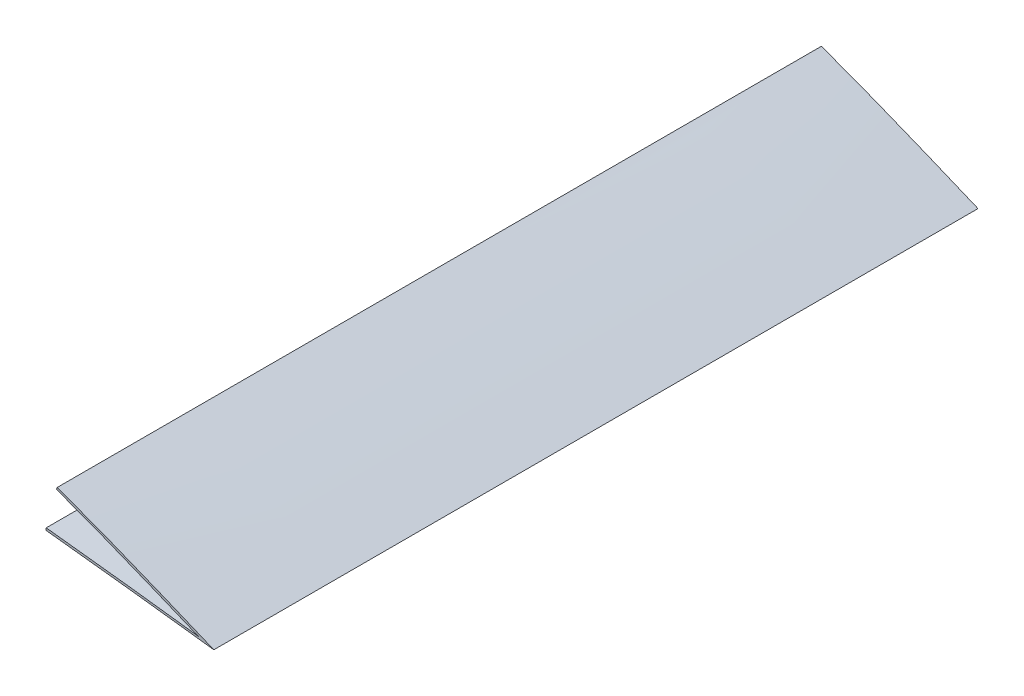
ISO-10303-21;
HEADER;
FILE_DESCRIPTION(('STEP AP214'),'2;1');
FILE_NAME('part.step','',(''),(''),'','','');
FILE_SCHEMA(('AUTOMOTIVE_DESIGN { 1 0 10303 214 1 1 1 1 }'));
ENDSEC;
DATA;
#1=APPLICATION_CONTEXT('core data for automotive mechanical design processes');
#2=APPLICATION_PROTOCOL_DEFINITION('international standard','automotive_design',2000,#1);
#3=PRODUCT_CONTEXT('',#1,'mechanical');
#4=PRODUCT('Part','Part','',(#3));
#5=PRODUCT_RELATED_PRODUCT_CATEGORY('part','',(#4));
#6=PRODUCT_DEFINITION_FORMATION('','',#4);
#7=PRODUCT_DEFINITION_CONTEXT('part definition',#1,'design');
#8=PRODUCT_DEFINITION('design','',#6,#7);
#9=PRODUCT_DEFINITION_SHAPE('','',#8);
#10=(LENGTH_UNIT() NAMED_UNIT(*) SI_UNIT(.MILLI.,.METRE.));
#11=(NAMED_UNIT(*) PLANE_ANGLE_UNIT() SI_UNIT($,.RADIAN.));
#12=(NAMED_UNIT(*) SI_UNIT($,.STERADIAN.) SOLID_ANGLE_UNIT());
#13=UNCERTAINTY_MEASURE_WITH_UNIT(LENGTH_MEASURE(1.E-05),#10,'distance_accuracy_value','');
#14=(GEOMETRIC_REPRESENTATION_CONTEXT(3) GLOBAL_UNCERTAINTY_ASSIGNED_CONTEXT((#13)) GLOBAL_UNIT_ASSIGNED_CONTEXT((#10,
#11,#12)) REPRESENTATION_CONTEXT('',''));
#15=CARTESIAN_POINT('',(0.,0.,0.));
#16=DIRECTION('',(0.,0.,1.));
#17=DIRECTION('',(1.,0.,0.));
#18=AXIS2_PLACEMENT_3D('',#15,#16,#17);
#19=CARTESIAN_POINT('',(1988.02305883041,2944.18599810179,174.625));
#20=CARTESIAN_POINT('',(1988.4860936965,2944.14044059067,174.625));
#21=CARTESIAN_POINT('',(1990.11861976774,2943.97758883364,174.625));
#22=CARTESIAN_POINT('',(1992.87856538639,2943.65192778852,174.625));
#23=CARTESIAN_POINT('',(1996.26056182215,2943.27824299011,174.625));
#24=CARTESIAN_POINT('',(1999.50276368961,2942.88136099166,174.625));
#25=CARTESIAN_POINT('',(2002.59505450618,2942.58817036161,174.625));
#26=CARTESIAN_POINT('',(2005.51427925806,2942.19869931625,174.625));
#27=CARTESIAN_POINT('',(2008.28630101592,2941.92861298624,174.625));
#28=CARTESIAN_POINT('',(2010.88552648472,2941.56905741507,174.625));
#29=CARTESIAN_POINT('',(2013.3339009843,2941.29983663925,174.625));
#30=CARTESIAN_POINT('',(2015.60789868894,2941.03328103495,174.625));
#31=CARTESIAN_POINT('',(2017.70584724161,2940.75505034335,174.625));
#32=CARTESIAN_POINT('',(2019.62940298667,2940.57851809757,174.625));
#33=CARTESIAN_POINT('',(2021.36766207254,2940.31482751687,174.625));
#34=CARTESIAN_POINT('',(2022.93120368427,2940.14747141157,174.625));
#35=CARTESIAN_POINT('',(2024.3197481941,2939.97788358142,174.625));
#36=CARTESIAN_POINT('',(2025.44054917517,2939.81131808059,174.625));
#37=CARTESIAN_POINT('',(2026.11368253309,2939.75555714232,174.625));
#38=CARTESIAN_POINT('',(2026.37812322283,2939.72601974893,174.625));
#39=B_SPLINE_CURVE_WITH_KNOTS('',3,(#19,#20,#21,#22,#23,#24,#25,#26,#27,#28,#29,#30,#31,#32,#33,
#34,#35,#36,#37,#38),.UNSPECIFIED.,.F.,.F.,(4,1,1,1,1,1,1,1,1,1,1,1,1,1,1,1,1,4),
(28.4329806907909,28.4879334748767,28.6267563678009,28.7612032643811,28.8898159231674,
29.0125341125278,29.1280218659914,29.2376094309799,29.3414338076934,29.4378933017833,
29.5285192075717,29.6118543910173,29.6878305241122,29.7565901692537,29.819438039544,
29.8735369008995,29.9218053046442,29.9532403861273),.UNSPECIFIED.);
#40=DIRECTION('',(0.,0.,-1.));
#41=VECTOR('',#40,1.);
#42=SURFACE_OF_LINEAR_EXTRUSION('',#39,#41);
#43=CARTESIAN_POINT('',(1988.02305883041,2944.18599810179,0.));
#44=CARTESIAN_POINT('',(1988.4860936965,2944.14044059067,0.));
#45=CARTESIAN_POINT('',(1990.11861976774,2943.97758883364,0.));
#46=CARTESIAN_POINT('',(1992.87856538639,2943.65192778852,0.));
#47=CARTESIAN_POINT('',(1996.26056182215,2943.27824299011,0.));
#48=CARTESIAN_POINT('',(1999.50276368961,2942.88136099166,0.));
#49=CARTESIAN_POINT('',(2002.59505450618,2942.58817036161,0.));
#50=CARTESIAN_POINT('',(2005.51427925806,2942.19869931625,0.));
#51=CARTESIAN_POINT('',(2008.28630101592,2941.92861298624,0.));
#52=CARTESIAN_POINT('',(2010.88552648472,2941.56905741507,0.));
#53=CARTESIAN_POINT('',(2013.3339009843,2941.29983663925,0.));
#54=CARTESIAN_POINT('',(2015.60789868894,2941.03328103495,0.));
#55=CARTESIAN_POINT('',(2017.70584724161,2940.75505034335,0.));
#56=CARTESIAN_POINT('',(2019.62940298667,2940.57851809757,0.));
#57=CARTESIAN_POINT('',(2021.36766207254,2940.31482751687,0.));
#58=CARTESIAN_POINT('',(2022.93120368427,2940.14747141157,0.));
#59=CARTESIAN_POINT('',(2024.3197481941,2939.97788358142,0.));
#60=CARTESIAN_POINT('',(2025.44054917517,2939.81131808059,0.));
#61=CARTESIAN_POINT('',(2026.11368253309,2939.75555714232,0.));
#62=CARTESIAN_POINT('',(2026.37812322283,2939.72601974893,0.));
#63=B_SPLINE_CURVE_WITH_KNOTS('',3,(#43,#44,#45,#46,#47,#48,#49,#50,#51,#52,#53,#54,#55,#56,#57,
#58,#59,#60,#61,#62),.UNSPECIFIED.,.F.,.F.,(4,1,1,1,1,1,1,1,1,1,1,1,1,1,1,1,1,4),
(28.4329806907909,28.4879334748767,28.6267563678009,28.7612032643811,28.8898159231674,
29.0125341125278,29.1280218659914,29.2376094309799,29.3414338076934,29.4378933017833,
29.5285192075717,29.6118543910173,29.6878305241122,29.7565901692537,29.819438039544,
29.8735369008995,29.9218053046442,29.9532403861273),.UNSPECIFIED.);
#64=CARTESIAN_POINT('',(1988.02305883041,2944.18599810179,0.));
#65=VERTEX_POINT('',#64);
#66=CARTESIAN_POINT('',(2026.37812322283,2939.72601974893,0.));
#67=VERTEX_POINT('',#66);
#68=EDGE_CURVE('E172',#65,#67,#63,.T.);
#69=ORIENTED_EDGE('',*,*,#68,.T.);
#70=DIRECTION('',(0.,0.,-1.));
#71=VECTOR('',#70,1.);
#72=CARTESIAN_POINT('',(2026.37812322283,2939.72601974893,174.625));
#73=LINE('',#72,#71);
#74=CARTESIAN_POINT('',(2026.37812322283,2939.72601974893,174.625));
#75=VERTEX_POINT('',#74);
#76=EDGE_CURVE('E11',#75,#67,#73,.T.);
#77=ORIENTED_EDGE('',*,*,#76,.F.);
#78=CARTESIAN_POINT('',(1988.02305883041,2944.18599810179,174.625));
#79=VERTEX_POINT('',#78);
#80=EDGE_CURVE('E144',#79,#75,#39,.T.);
#81=ORIENTED_EDGE('',*,*,#80,.F.);
#82=DIRECTION('',(0.,0.,-1.));
#83=VECTOR('',#82,1.);
#84=CARTESIAN_POINT('',(1988.02305883041,2944.18599810179,174.625));
#85=LINE('',#84,#83);
#86=EDGE_CURVE('E114',#79,#65,#85,.T.);
#87=ORIENTED_EDGE('',*,*,#86,.T.);
#88=EDGE_LOOP('',(#69,#77,#81,#87));
#89=FACE_BOUND('',#88,.T.);
#90=ADVANCED_FACE('F33',(#89),#42,.F.);
#91=CARTESIAN_POINT('',(2026.37812322283,2939.72601974893,174.625));
#92=CARTESIAN_POINT('',(2025.7723670329,2939.96681770488,174.625));
#93=CARTESIAN_POINT('',(2025.16700119327,2940.20806577561,174.625));
#94=CARTESIAN_POINT('',(2024.56327016065,2940.45119895005,174.625));
#95=CARTESIAN_POINT('',(2024.25244988756,2940.57637177635,174.625));
#96=CARTESIAN_POINT('',(2023.94206292393,2940.70204425383,174.625));
#97=CARTESIAN_POINT('',(2023.63227908525,2940.82841219755,174.625));
#98=CARTESIAN_POINT('',(2019.92290730254,2942.34155015426,174.625));
#99=CARTESIAN_POINT('',(2016.30001050763,2943.95440282884,174.625));
#100=CARTESIAN_POINT('',(2008.84038212805,2946.88486291156,174.625));
#101=CARTESIAN_POINT('',(2005.18204635352,2948.44600331714,174.625));
#102=CARTESIAN_POINT('',(1998.49830218971,2950.9925617946,174.625));
#103=CARTESIAN_POINT('',(1995.57534901207,2952.14370847279,174.625));
#104=CARTESIAN_POINT('',(1991.93586782327,2953.47362866195,174.625));
#105=CARTESIAN_POINT('',(1991.26652278171,2953.72164072025,174.625));
#106=CARTESIAN_POINT('',(1990.59802874074,2953.97095841238,174.625));
#107=B_SPLINE_CURVE_WITH_KNOTS('',3,(#91,#92,#93,#94,#95,#96,#97,#98,#99,#100,#101,#102,#103,
#104,#105,#106),.UNSPECIFIED.,.F.,.F.,(4,3,3,2,2,2,4),(0.099020879068913,0.175577173941332,
0.214990831999981,0.686932530696415,1.15887422939285,1.53165502309098,1.61589570104789),.UNSPECIFIED.);
#108=DIRECTION('',(0.,0.,-1.));
#109=VECTOR('',#108,1.);
#110=SURFACE_OF_LINEAR_EXTRUSION('',#107,#109);
#111=CARTESIAN_POINT('',(2026.37812322283,2939.72601974893,0.));
#112=CARTESIAN_POINT('',(2025.7723670329,2939.96681770488,0.));
#113=CARTESIAN_POINT('',(2025.16700119327,2940.20806577561,0.));
#114=CARTESIAN_POINT('',(2024.56327016065,2940.45119895005,0.));
#115=CARTESIAN_POINT('',(2024.25244988756,2940.57637177635,0.));
#116=CARTESIAN_POINT('',(2023.94206292393,2940.70204425383,0.));
#117=CARTESIAN_POINT('',(2023.63227908525,2940.82841219755,0.));
#118=CARTESIAN_POINT('',(2019.92290730254,2942.34155015426,0.));
#119=CARTESIAN_POINT('',(2016.30001050763,2943.95440282884,0.));
#120=CARTESIAN_POINT('',(2008.84038212805,2946.88486291156,0.));
#121=CARTESIAN_POINT('',(2005.18204635352,2948.44600331714,0.));
#122=CARTESIAN_POINT('',(1998.49830218971,2950.9925617946,0.));
#123=CARTESIAN_POINT('',(1995.57534901207,2952.14370847279,0.));
#124=CARTESIAN_POINT('',(1991.93586782327,2953.47362866195,0.));
#125=CARTESIAN_POINT('',(1991.26652278171,2953.72164072025,0.));
#126=CARTESIAN_POINT('',(1990.59802874074,2953.97095841238,0.));
#127=B_SPLINE_CURVE_WITH_KNOTS('',3,(#111,#112,#113,#114,#115,#116,#117,#118,#119,#120,#121,
#122,#123,#124,#125,#126),.UNSPECIFIED.,.F.,.F.,(4,3,3,2,2,2,4),(0.099020879068913,
0.175577173941332,0.214990831999981,0.686932530696415,1.15887422939285,1.53165502309098,
1.61589570104789),.UNSPECIFIED.);
#128=CARTESIAN_POINT('',(1990.59802874074,2953.97095841238,0.));
#129=VERTEX_POINT('',#128);
#130=EDGE_CURVE('E170',#67,#129,#127,.T.);
#131=ORIENTED_EDGE('',*,*,#130,.T.);
#132=DIRECTION('',(0.,0.,-1.));
#133=VECTOR('',#132,1.);
#134=CARTESIAN_POINT('',(1990.59802874074,2953.97095841238,174.625));
#135=LINE('',#134,#133);
#136=CARTESIAN_POINT('',(1990.59802874074,2953.97095841238,174.625));
#137=VERTEX_POINT('',#136);
#138=EDGE_CURVE('E42',#137,#129,#135,.T.);
#139=ORIENTED_EDGE('',*,*,#138,.F.);
#140=EDGE_CURVE('E87',#75,#137,#107,.T.);
#141=ORIENTED_EDGE('',*,*,#140,.F.);
#142=ORIENTED_EDGE('',*,*,#76,.T.);
#143=EDGE_LOOP('',(#131,#139,#141,#142));
#144=FACE_BOUND('',#143,.T.);
#145=ADVANCED_FACE('F137',(#144),#110,.F.);
#146=CARTESIAN_POINT('',(1990.42148669339,2953.49755342874,174.625));
#147=DIRECTION('',(0.936968441110629,-0.349413995659473,0.));
#148=DIRECTION('',(0.349413995659473,0.936968441110629,0.));
#149=AXIS2_PLACEMENT_3D('',#146,#147,#148);
#150=PLANE('',#149);
#151=DIRECTION('',(-0.349413995659473,-0.936968441110629,0.));
#152=VECTOR('',#151,1.);
#153=CARTESIAN_POINT('',(1990.42148669339,2953.49755342874,0.));
#154=LINE('',#153,#152);
#155=CARTESIAN_POINT('',(1990.42148669339,2953.49755342874,0.));
#156=VERTEX_POINT('',#155);
#157=EDGE_CURVE('E166',#129,#156,#154,.T.);
#158=ORIENTED_EDGE('',*,*,#157,.T.);
#159=DIRECTION('',(0.,0.,-1.));
#160=VECTOR('',#159,1.);
#161=CARTESIAN_POINT('',(1990.42148669339,2953.49755342874,174.625));
#162=LINE('',#161,#160);
#163=CARTESIAN_POINT('',(1990.42148669339,2953.49755342874,174.625));
#164=VERTEX_POINT('',#163);
#165=EDGE_CURVE('E109',#164,#156,#162,.T.);
#166=ORIENTED_EDGE('',*,*,#165,.F.);
#167=DIRECTION('',(-0.349413995659473,-0.936968441110629,0.));
#168=VECTOR('',#167,1.);
#169=CARTESIAN_POINT('',(1990.42148669339,2953.49755342874,174.625));
#170=LINE('',#169,#168);
#171=EDGE_CURVE('E100',#137,#164,#170,.T.);
#172=ORIENTED_EDGE('',*,*,#171,.F.);
#173=ORIENTED_EDGE('',*,*,#138,.T.);
#174=EDGE_LOOP('',(#158,#166,#172,#173));
#175=FACE_BOUND('',#174,.T.);
#176=ADVANCED_FACE('F135',(#175),#150,.F.);
#177=CARTESIAN_POINT('',(1990.42148669339,2953.49755342874,174.625));
#178=CARTESIAN_POINT('',(1991.26608646929,2953.18432727958,174.625));
#179=CARTESIAN_POINT('',(1992.11061416994,2952.87083292376,174.625));
#180=CARTESIAN_POINT('',(1997.44616335028,2950.89237515585,174.625));
#181=CARTESIAN_POINT('',(2001.86633493205,2949.19683033505,174.625));
#182=CARTESIAN_POINT('',(2010.80211572768,2945.57558877682,174.625));
#183=CARTESIAN_POINT('',(2015.21732369742,2943.78783922893,174.625));
#184=CARTESIAN_POINT('',(2020.71630821281,2941.50699908588,174.625));
#185=CARTESIAN_POINT('',(2021.79802890697,2941.06151206462,174.625));
#186=CARTESIAN_POINT('',(2022.86646084304,2940.6145709774,174.625));
#187=B_SPLINE_CURVE_WITH_KNOTS('',3,(#177,#178,#179,#180,#181,#182,#183,#184,#185,#186),
.UNSPECIFIED.,.F.,.F.,(4,2,2,2,4),(0.2403730921367,0.346917733175911,0.913321397798007,
1.4797250624201,1.6161767153474),.UNSPECIFIED.);
#188=DIRECTION('',(0.,0.,-1.));
#189=VECTOR('',#188,1.);
#190=SURFACE_OF_LINEAR_EXTRUSION('',#187,#189);
#191=CARTESIAN_POINT('',(1990.42148669339,2953.49755342874,0.));
#192=CARTESIAN_POINT('',(1991.26608646929,2953.18432727958,0.));
#193=CARTESIAN_POINT('',(1992.11061416994,2952.87083292376,0.));
#194=CARTESIAN_POINT('',(1997.44616335028,2950.89237515585,0.));
#195=CARTESIAN_POINT('',(2001.86633493205,2949.19683033505,0.));
#196=CARTESIAN_POINT('',(2010.80211572768,2945.57558877682,0.));
#197=CARTESIAN_POINT('',(2015.21732369742,2943.78783922893,0.));
#198=CARTESIAN_POINT('',(2020.71630821281,2941.50699908588,0.));
#199=CARTESIAN_POINT('',(2021.79802890697,2941.06151206462,0.));
#200=CARTESIAN_POINT('',(2022.86646084304,2940.6145709774,0.));
#201=B_SPLINE_CURVE_WITH_KNOTS('',3,(#191,#192,#193,#194,#195,#196,#197,#198,#199,#200),
.UNSPECIFIED.,.F.,.F.,(4,2,2,2,4),(0.2403730921367,0.346917733175911,0.913321397798007,
1.4797250624201,1.6161767153474),.UNSPECIFIED.);
#202=CARTESIAN_POINT('',(2022.86646084304,2940.6145709774,0.));
#203=VERTEX_POINT('',#202);
#204=EDGE_CURVE('E108',#156,#203,#201,.T.);
#205=ORIENTED_EDGE('',*,*,#204,.T.);
#206=DIRECTION('',(0.,0.,-1.));
#207=VECTOR('',#206,1.);
#208=CARTESIAN_POINT('',(2022.86646084304,2940.6145709774,174.625));
#209=LINE('',#208,#207);
#210=CARTESIAN_POINT('',(2022.86646084304,2940.6145709774,174.625));
#211=VERTEX_POINT('',#210);
#212=EDGE_CURVE('E105',#211,#203,#209,.T.);
#213=ORIENTED_EDGE('',*,*,#212,.F.);
#214=EDGE_CURVE('E94',#164,#211,#187,.T.);
#215=ORIENTED_EDGE('',*,*,#214,.F.);
#216=ORIENTED_EDGE('',*,*,#165,.T.);
#217=EDGE_LOOP('',(#205,#213,#215,#216));
#218=FACE_BOUND('',#217,.T.);
#219=ADVANCED_FACE('F106',(#218),#190,.F.);
#220=CARTESIAN_POINT('',(2022.86646084304,2940.6145709774,174.625));
#221=CARTESIAN_POINT('',(2018.88458440234,2941.06761583129,174.625));
#222=CARTESIAN_POINT('',(2014.99093126998,2941.58752498364,174.625));
#223=CARTESIAN_POINT('',(2004.5956555186,2942.86683582677,174.625));
#224=CARTESIAN_POINT('',(1998.05216280753,2943.57578634532,174.625));
#225=CARTESIAN_POINT('',(1990.38562197459,2944.45341124992,174.625));
#226=CARTESIAN_POINT('',(1989.23015051689,2944.58289678001,174.625));
#227=CARTESIAN_POINT('',(1988.07460597749,2944.70991009258,174.625));
#228=B_SPLINE_CURVE_WITH_KNOTS('',3,(#220,#221,#222,#223,#224,#225,#226,#227),.UNSPECIFIED.,.F.,
.F.,(4,2,2,4),(28.432746501601,28.9032200601273,29.6765714038467,29.8138144101908),.UNSPECIFIED.);
#229=DIRECTION('',(0.,0.,-1.));
#230=VECTOR('',#229,1.);
#231=SURFACE_OF_LINEAR_EXTRUSION('',#228,#230);
#232=CARTESIAN_POINT('',(2022.86646084304,2940.6145709774,0.));
#233=CARTESIAN_POINT('',(2018.88458440234,2941.06761583129,0.));
#234=CARTESIAN_POINT('',(2014.99093126998,2941.58752498364,0.));
#235=CARTESIAN_POINT('',(2004.5956555186,2942.86683582677,0.));
#236=CARTESIAN_POINT('',(1998.05216280753,2943.57578634532,0.));
#237=CARTESIAN_POINT('',(1990.38562197459,2944.45341124992,0.));
#238=CARTESIAN_POINT('',(1989.23015051689,2944.58289678001,0.));
#239=CARTESIAN_POINT('',(1988.07460597749,2944.70991009258,0.));
#240=B_SPLINE_CURVE_WITH_KNOTS('',3,(#232,#233,#234,#235,#236,#237,#238,#239),.UNSPECIFIED.,.F.,
.F.,(4,2,2,4),(28.432746501601,28.9032200601273,29.6765714038467,29.8138144101908),.UNSPECIFIED.);
#241=CARTESIAN_POINT('',(1988.07460597749,2944.70991009258,0.));
#242=VERTEX_POINT('',#241);
#243=EDGE_CURVE('E73',#203,#242,#240,.T.);
#244=ORIENTED_EDGE('',*,*,#243,.T.);
#245=DIRECTION('',(0.,0.,-1.));
#246=VECTOR('',#245,1.);
#247=CARTESIAN_POINT('',(1988.07460597749,2944.70991009258,174.625));
#248=LINE('',#247,#246);
#249=CARTESIAN_POINT('',(1988.07460597749,2944.70991009258,174.625));
#250=VERTEX_POINT('',#249);
#251=EDGE_CURVE('E110',#250,#242,#248,.T.);
#252=ORIENTED_EDGE('',*,*,#251,.F.);
#253=EDGE_CURVE('E98',#211,#250,#228,.T.);
#254=ORIENTED_EDGE('',*,*,#253,.F.);
#255=ORIENTED_EDGE('',*,*,#212,.T.);
#256=EDGE_LOOP('',(#244,#252,#254,#255));
#257=FACE_BOUND('',#256,.T.);
#258=ADVANCED_FACE('F112',(#257),#231,.F.);
#259=CARTESIAN_POINT('',(1988.07460597749,2944.70991009258,174.625));
#260=DIRECTION('',(0.995194668018483,-0.0979161516174972,0.));
#261=DIRECTION('',(0.0979161516174972,0.995194668018483,0.));
#262=AXIS2_PLACEMENT_3D('',#259,#260,#261);
#263=PLANE('',#262);
#264=DIRECTION('',(-0.0979161516174972,-0.995194668018483,0.));
#265=VECTOR('',#264,1.);
#266=CARTESIAN_POINT('',(1988.07460597749,2944.70991009258,0.));
#267=LINE('',#266,#265);
#268=EDGE_CURVE('E79',#242,#65,#267,.T.);
#269=ORIENTED_EDGE('',*,*,#268,.T.);
#270=ORIENTED_EDGE('',*,*,#86,.F.);
#271=DIRECTION('',(-0.0979161516174972,-0.995194668018483,0.));
#272=VECTOR('',#271,1.);
#273=CARTESIAN_POINT('',(1988.07460597749,2944.70991009258,174.625));
#274=LINE('',#273,#272);
#275=EDGE_CURVE('E50',#250,#79,#274,.T.);
#276=ORIENTED_EDGE('',*,*,#275,.F.);
#277=ORIENTED_EDGE('',*,*,#251,.T.);
#278=EDGE_LOOP('',(#269,#270,#276,#277));
#279=FACE_BOUND('',#278,.T.);
#280=ADVANCED_FACE('F131',(#279),#263,.F.);
#281=CARTESIAN_POINT('',(2007.20939270748,2942.03057340049,174.625));
#282=DIRECTION('',(0.,0.,1.));
#283=DIRECTION('',(1.,0.,0.));
#284=AXIS2_PLACEMENT_3D('',#281,#282,#283);
#285=PLANE('',#284);
#286=ORIENTED_EDGE('',*,*,#80,.T.);
#287=ORIENTED_EDGE('',*,*,#140,.T.);
#288=ORIENTED_EDGE('',*,*,#171,.T.);
#289=ORIENTED_EDGE('',*,*,#214,.T.);
#290=ORIENTED_EDGE('',*,*,#253,.T.);
#291=ORIENTED_EDGE('',*,*,#275,.T.);
#292=EDGE_LOOP('',(#286,#287,#288,#289,#290,#291));
#293=FACE_BOUND('',#292,.T.);
#294=ADVANCED_FACE('F96',(#293),#285,.T.);
#295=CARTESIAN_POINT('',(2007.20939270748,2942.03057340049,0.));
#296=DIRECTION('',(0.,0.,1.));
#297=DIRECTION('',(1.,0.,0.));
#298=AXIS2_PLACEMENT_3D('',#295,#296,#297);
#299=PLANE('',#298);
#300=ORIENTED_EDGE('',*,*,#68,.F.);
#301=ORIENTED_EDGE('',*,*,#268,.F.);
#302=ORIENTED_EDGE('',*,*,#243,.F.);
#303=ORIENTED_EDGE('',*,*,#204,.F.);
#304=ORIENTED_EDGE('',*,*,#157,.F.);
#305=ORIENTED_EDGE('',*,*,#130,.F.);
#306=EDGE_LOOP('',(#300,#301,#302,#303,#304,#305));
#307=FACE_BOUND('',#306,.T.);
#308=ADVANCED_FACE('F169',(#307),#299,.F.);
#309=CLOSED_SHELL('',(#90,#145,#176,#219,#258,#280,#294,#308));
#310=MANIFOLD_SOLID_BREP('B2',#309);
#311=ADVANCED_BREP_SHAPE_REPRESENTATION('',(#18,#310),#14);
#312=SHAPE_DEFINITION_REPRESENTATION(#9,#311);
ENDSEC;
END-ISO-10303-21;
